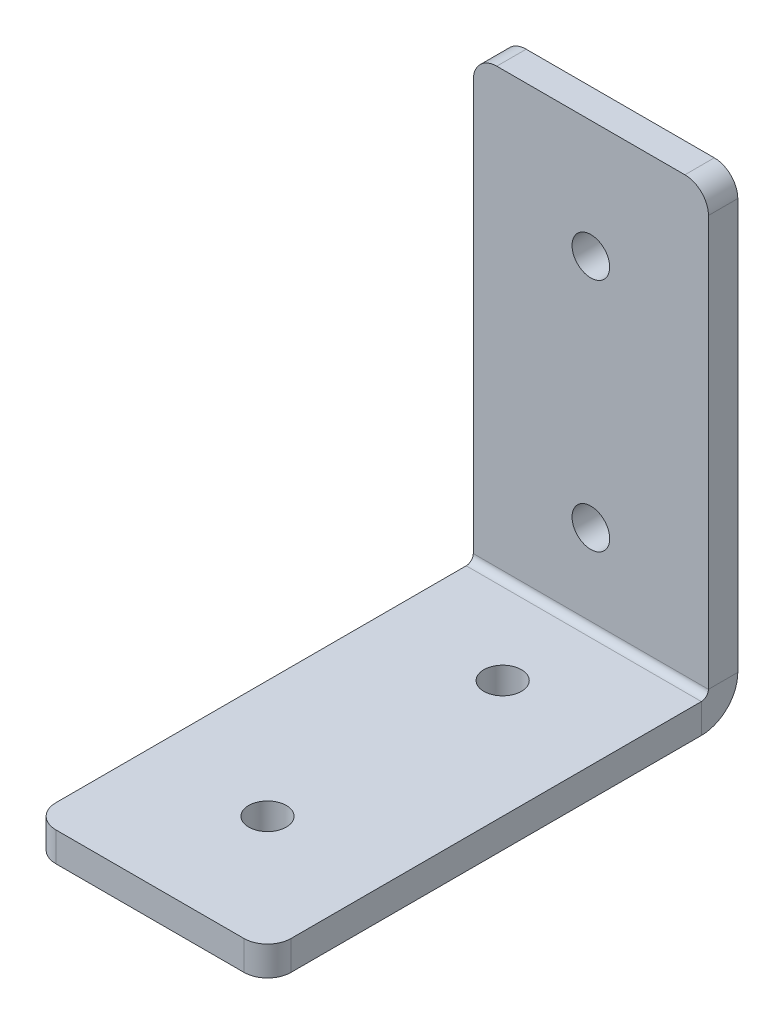
ISO-10303-21;
HEADER;
FILE_DESCRIPTION(('STEP AP214'),'2;1');
FILE_NAME('part.step','',(''),(''),'','','');
FILE_SCHEMA(('AUTOMOTIVE_DESIGN { 1 0 10303 214 1 1 1 1 }'));
ENDSEC;
DATA;
#1=APPLICATION_CONTEXT('core data for automotive mechanical design processes');
#2=APPLICATION_PROTOCOL_DEFINITION('international standard','automotive_design',2000,#1);
#3=PRODUCT_CONTEXT('',#1,'mechanical');
#4=PRODUCT('Part','Part','',(#3));
#5=PRODUCT_RELATED_PRODUCT_CATEGORY('part','',(#4));
#6=PRODUCT_DEFINITION_FORMATION('','',#4);
#7=PRODUCT_DEFINITION_CONTEXT('part definition',#1,'design');
#8=PRODUCT_DEFINITION('design','',#6,#7);
#9=PRODUCT_DEFINITION_SHAPE('','',#8);
#10=(LENGTH_UNIT() NAMED_UNIT(*) SI_UNIT(.MILLI.,.METRE.));
#11=(NAMED_UNIT(*) PLANE_ANGLE_UNIT() SI_UNIT($,.RADIAN.));
#12=(NAMED_UNIT(*) SI_UNIT($,.STERADIAN.) SOLID_ANGLE_UNIT());
#13=UNCERTAINTY_MEASURE_WITH_UNIT(LENGTH_MEASURE(1.E-05),#10,'distance_accuracy_value','');
#14=(GEOMETRIC_REPRESENTATION_CONTEXT(3) GLOBAL_UNCERTAINTY_ASSIGNED_CONTEXT((#13)) GLOBAL_UNIT_ASSIGNED_CONTEXT((#10,
#11,#12)) REPRESENTATION_CONTEXT('',''));
#15=CARTESIAN_POINT('',(0.,0.,0.));
#16=DIRECTION('',(0.,0.,1.));
#17=DIRECTION('',(1.,0.,0.));
#18=AXIS2_PLACEMENT_3D('',#15,#16,#17);
#19=CARTESIAN_POINT('',(-12.7,1.27,-25.4));
#20=DIRECTION('',(-1.,0.,0.));
#21=DIRECTION('',(0.,-1.,0.));
#22=AXIS2_PLACEMENT_3D('',#19,#20,#21);
#23=PLANE('',#22);
#24=DIRECTION('',(0.,1.,0.));
#25=VECTOR('',#24,1.);
#26=CARTESIAN_POINT('',(-12.7,1.27,-22.225));
#27=LINE('',#26,#25);
#28=CARTESIAN_POINT('',(-12.7,48.26,-22.225));
#29=VERTEX_POINT('',#28);
#30=CARTESIAN_POINT('',(-12.7,3.937,-22.225));
#31=VERTEX_POINT('',#30);
#32=EDGE_CURVE('E194',#29,#31,#27,.F.);
#33=ORIENTED_EDGE('',*,*,#32,.F.);
#34=DIRECTION('',(0.,0.,1.));
#35=VECTOR('',#34,1.);
#36=CARTESIAN_POINT('',(-12.7,48.26,-25.4));
#37=LINE('',#36,#35);
#38=CARTESIAN_POINT('',(-12.7,48.26,-25.4));
#39=VERTEX_POINT('',#38);
#40=EDGE_CURVE('E137',#29,#39,#37,.F.);
#41=ORIENTED_EDGE('',*,*,#40,.T.);
#42=DIRECTION('',(0.,-1.,0.));
#43=VECTOR('',#42,1.);
#44=CARTESIAN_POINT('',(-12.7,1.27,-25.4));
#45=LINE('',#44,#43);
#46=CARTESIAN_POINT('',(-12.7,3.937,-25.4));
#47=VERTEX_POINT('',#46);
#48=EDGE_CURVE('E131',#39,#47,#45,.T.);
#49=ORIENTED_EDGE('',*,*,#48,.T.);
#50=DIRECTION('',(0.,0.,-1.));
#51=VECTOR('',#50,1.);
#52=CARTESIAN_POINT('',(-12.7,3.937,-25.4));
#53=LINE('',#52,#51);
#54=EDGE_CURVE('E134',#31,#47,#53,.T.);
#55=ORIENTED_EDGE('',*,*,#54,.F.);
#56=EDGE_LOOP('',(#33,#41,#49,#55));
#57=FACE_BOUND('',#56,.T.);
#58=ADVANCED_FACE('F38',(#57),#23,.T.);
#59=CARTESIAN_POINT('',(12.7,50.8,-25.4));
#60=DIRECTION('',(0.,-1.,0.));
#61=DIRECTION('',(1.,0.,0.));
#62=AXIS2_PLACEMENT_3D('',#59,#60,#61);
#63=PLANE('',#62);
#64=DIRECTION('',(1.,0.,0.));
#65=VECTOR('',#64,1.);
#66=CARTESIAN_POINT('',(12.7,50.8,-25.4));
#67=LINE('',#66,#65);
#68=CARTESIAN_POINT('',(-10.16,50.8,-25.4));
#69=VERTEX_POINT('',#68);
#70=CARTESIAN_POINT('',(10.16,50.8,-25.4));
#71=VERTEX_POINT('',#70);
#72=EDGE_CURVE('E140',#69,#71,#67,.T.);
#73=ORIENTED_EDGE('',*,*,#72,.F.);
#74=DIRECTION('',(0.,0.,-1.));
#75=VECTOR('',#74,1.);
#76=CARTESIAN_POINT('',(-10.16,50.8,-25.4));
#77=LINE('',#76,#75);
#78=CARTESIAN_POINT('',(-10.16,50.8,-22.225));
#79=VERTEX_POINT('',#78);
#80=EDGE_CURVE('E224',#69,#79,#77,.F.);
#81=ORIENTED_EDGE('',*,*,#80,.T.);
#82=DIRECTION('',(1.,0.,0.));
#83=VECTOR('',#82,1.);
#84=CARTESIAN_POINT('',(-12.7,50.8,-22.225));
#85=LINE('',#84,#83);
#86=CARTESIAN_POINT('',(10.16,50.8,-22.225));
#87=VERTEX_POINT('',#86);
#88=EDGE_CURVE('E198',#79,#87,#85,.T.);
#89=ORIENTED_EDGE('',*,*,#88,.T.);
#90=DIRECTION('',(0.,0.,1.));
#91=VECTOR('',#90,1.);
#92=CARTESIAN_POINT('',(10.16,50.8,-25.4));
#93=LINE('',#92,#91);
#94=EDGE_CURVE('E221',#87,#71,#93,.F.);
#95=ORIENTED_EDGE('',*,*,#94,.T.);
#96=EDGE_LOOP('',(#73,#81,#89,#95));
#97=FACE_BOUND('',#96,.T.);
#98=ADVANCED_FACE('F294',(#97),#63,.F.);
#99=CARTESIAN_POINT('',(12.7,1.27,-25.4));
#100=DIRECTION('',(-1.,0.,0.));
#101=DIRECTION('',(0.,-1.,0.));
#102=AXIS2_PLACEMENT_3D('',#99,#100,#101);
#103=PLANE('',#102);
#104=DIRECTION('',(0.,-1.,0.));
#105=VECTOR('',#104,1.);
#106=CARTESIAN_POINT('',(12.7,1.27,-25.4));
#107=LINE('',#106,#105);
#108=CARTESIAN_POINT('',(12.7,48.26,-25.4));
#109=VERTEX_POINT('',#108);
#110=CARTESIAN_POINT('',(12.7,3.937,-25.4));
#111=VERTEX_POINT('',#110);
#112=EDGE_CURVE('E166',#109,#111,#107,.T.);
#113=ORIENTED_EDGE('',*,*,#112,.F.);
#114=DIRECTION('',(0.,0.,1.));
#115=VECTOR('',#114,1.);
#116=CARTESIAN_POINT('',(12.7,48.26,-25.4));
#117=LINE('',#116,#115);
#118=CARTESIAN_POINT('',(12.7,48.26,-22.225));
#119=VERTEX_POINT('',#118);
#120=EDGE_CURVE('E230',#109,#119,#117,.T.);
#121=ORIENTED_EDGE('',*,*,#120,.T.);
#122=DIRECTION('',(0.,1.,0.));
#123=VECTOR('',#122,1.);
#124=CARTESIAN_POINT('',(12.7,1.27,-22.225));
#125=LINE('',#124,#123);
#126=CARTESIAN_POINT('',(12.7,3.937,-22.225));
#127=VERTEX_POINT('',#126);
#128=EDGE_CURVE('E195',#119,#127,#125,.F.);
#129=ORIENTED_EDGE('',*,*,#128,.T.);
#130=DIRECTION('',(0.,0.,-1.));
#131=VECTOR('',#130,1.);
#132=CARTESIAN_POINT('',(12.7,3.937,-25.4));
#133=LINE('',#132,#131);
#134=EDGE_CURVE('E152',#127,#111,#133,.T.);
#135=ORIENTED_EDGE('',*,*,#134,.T.);
#136=EDGE_LOOP('',(#113,#121,#129,#135));
#137=FACE_BOUND('',#136,.T.);
#138=ADVANCED_FACE('F299',(#137),#103,.F.);
#139=CARTESIAN_POINT('',(12.7,3.937,-21.463));
#140=DIRECTION('',(1.,0.,0.));
#141=DIRECTION('',(0.,0.,-1.));
#142=AXIS2_PLACEMENT_3D('',#139,#140,#141);
#143=PLANE('',#142);
#144=ORIENTED_EDGE('',*,*,#134,.F.);
#145=CARTESIAN_POINT('',(12.7,3.937,-21.463));
#146=DIRECTION('',(1.,0.,0.));
#147=DIRECTION('',(0.,0.,-1.));
#148=AXIS2_PLACEMENT_3D('',#145,#146,#147);
#149=CIRCLE('',#148,0.762);
#150=CARTESIAN_POINT('',(12.7,3.175,-21.463));
#151=VERTEX_POINT('',#150);
#152=EDGE_CURVE('E191',#127,#151,#149,.F.);
#153=ORIENTED_EDGE('',*,*,#152,.T.);
#154=DIRECTION('',(0.,-1.,0.));
#155=VECTOR('',#154,1.);
#156=CARTESIAN_POINT('',(12.7,0.,-21.463));
#157=LINE('',#156,#155);
#158=CARTESIAN_POINT('',(12.7,0.,-21.463));
#159=VERTEX_POINT('',#158);
#160=EDGE_CURVE('E211',#151,#159,#157,.T.);
#161=ORIENTED_EDGE('',*,*,#160,.T.);
#162=CARTESIAN_POINT('',(12.7,3.937,-21.463));
#163=DIRECTION('',(-1.,0.,0.));
#164=DIRECTION('',(0.,0.,1.));
#165=AXIS2_PLACEMENT_3D('',#162,#163,#164);
#166=CIRCLE('',#165,3.937);
#167=EDGE_CURVE('E141',#111,#159,#166,.T.);
#168=ORIENTED_EDGE('',*,*,#167,.F.);
#169=EDGE_LOOP('',(#144,#153,#161,#168));
#170=FACE_BOUND('',#169,.T.);
#171=ADVANCED_FACE('F376',(#170),#143,.T.);
#172=CARTESIAN_POINT('',(12.7,0.,25.4));
#173=DIRECTION('',(-1.,0.,0.));
#174=DIRECTION('',(0.,0.,-1.));
#175=AXIS2_PLACEMENT_3D('',#172,#173,#174);
#176=PLANE('',#175);
#177=DIRECTION('',(0.,0.,-1.));
#178=VECTOR('',#177,1.);
#179=CARTESIAN_POINT('',(12.7,3.175,0.));
#180=LINE('',#179,#178);
#181=CARTESIAN_POINT('',(12.7,3.175,22.86));
#182=VERTEX_POINT('',#181);
#183=EDGE_CURVE('E185',#182,#151,#180,.T.);
#184=ORIENTED_EDGE('',*,*,#183,.F.);
#185=DIRECTION('',(0.,1.,0.));
#186=VECTOR('',#185,1.);
#187=CARTESIAN_POINT('',(12.7,0.,22.86));
#188=LINE('',#187,#186);
#189=CARTESIAN_POINT('',(12.7,0.,22.86));
#190=VERTEX_POINT('',#189);
#191=EDGE_CURVE('E11',#182,#190,#188,.F.);
#192=ORIENTED_EDGE('',*,*,#191,.T.);
#193=DIRECTION('',(0.,0.,-1.));
#194=VECTOR('',#193,1.);
#195=CARTESIAN_POINT('',(12.7,0.,25.4));
#196=LINE('',#195,#194);
#197=EDGE_CURVE('E262',#190,#159,#196,.T.);
#198=ORIENTED_EDGE('',*,*,#197,.T.);
#199=ORIENTED_EDGE('',*,*,#160,.F.);
#200=EDGE_LOOP('',(#184,#192,#198,#199));
#201=FACE_BOUND('',#200,.T.);
#202=ADVANCED_FACE('F337',(#201),#176,.F.);
#203=CARTESIAN_POINT('',(-12.7,0.,25.4));
#204=DIRECTION('',(0.,0.,-1.));
#205=DIRECTION('',(1.,0.,0.));
#206=AXIS2_PLACEMENT_3D('',#203,#204,#205);
#207=PLANE('',#206);
#208=DIRECTION('',(1.,0.,0.));
#209=VECTOR('',#208,1.);
#210=CARTESIAN_POINT('',(0.,3.175,25.4));
#211=LINE('',#210,#209);
#212=CARTESIAN_POINT('',(-10.16,3.175,25.4));
#213=VERTEX_POINT('',#212);
#214=CARTESIAN_POINT('',(10.16,3.175,25.4));
#215=VERTEX_POINT('',#214);
#216=EDGE_CURVE('E186',#213,#215,#211,.T.);
#217=ORIENTED_EDGE('',*,*,#216,.F.);
#218=DIRECTION('',(0.,1.,0.));
#219=VECTOR('',#218,1.);
#220=CARTESIAN_POINT('',(-10.16,0.,25.4));
#221=LINE('',#220,#219);
#222=CARTESIAN_POINT('',(-10.16,0.,25.4));
#223=VERTEX_POINT('',#222);
#224=EDGE_CURVE('E234',#213,#223,#221,.F.);
#225=ORIENTED_EDGE('',*,*,#224,.T.);
#226=DIRECTION('',(1.,0.,0.));
#227=VECTOR('',#226,1.);
#228=CARTESIAN_POINT('',(-12.7,0.,25.4));
#229=LINE('',#228,#227);
#230=CARTESIAN_POINT('',(10.16,0.,25.4));
#231=VERTEX_POINT('',#230);
#232=EDGE_CURVE('E260',#223,#231,#229,.T.);
#233=ORIENTED_EDGE('',*,*,#232,.T.);
#234=DIRECTION('',(0.,1.,0.));
#235=VECTOR('',#234,1.);
#236=CARTESIAN_POINT('',(10.16,0.,25.4));
#237=LINE('',#236,#235);
#238=EDGE_CURVE('E232',#231,#215,#237,.T.);
#239=ORIENTED_EDGE('',*,*,#238,.T.);
#240=EDGE_LOOP('',(#217,#225,#233,#239));
#241=FACE_BOUND('',#240,.T.);
#242=ADVANCED_FACE('F250',(#241),#207,.F.);
#243=CARTESIAN_POINT('',(-12.7,0.,25.4));
#244=DIRECTION('',(1.,0.,0.));
#245=DIRECTION('',(0.,0.,1.));
#246=AXIS2_PLACEMENT_3D('',#243,#244,#245);
#247=PLANE('',#246);
#248=DIRECTION('',(0.,0.,1.));
#249=VECTOR('',#248,1.);
#250=CARTESIAN_POINT('',(-12.7,0.,25.4));
#251=LINE('',#250,#249);
#252=CARTESIAN_POINT('',(-12.7,0.,-21.463));
#253=VERTEX_POINT('',#252);
#254=CARTESIAN_POINT('',(-12.7,0.,22.86));
#255=VERTEX_POINT('',#254);
#256=EDGE_CURVE('E259',#253,#255,#251,.T.);
#257=ORIENTED_EDGE('',*,*,#256,.T.);
#258=DIRECTION('',(0.,1.,0.));
#259=VECTOR('',#258,1.);
#260=CARTESIAN_POINT('',(-12.7,0.,22.86));
#261=LINE('',#260,#259);
#262=CARTESIAN_POINT('',(-12.7,3.175,22.86));
#263=VERTEX_POINT('',#262);
#264=EDGE_CURVE('E61',#255,#263,#261,.T.);
#265=ORIENTED_EDGE('',*,*,#264,.T.);
#266=DIRECTION('',(0.,0.,-1.));
#267=VECTOR('',#266,1.);
#268=CARTESIAN_POINT('',(-12.7,3.175,0.));
#269=LINE('',#268,#267);
#270=CARTESIAN_POINT('',(-12.7,3.175,-21.463));
#271=VERTEX_POINT('',#270);
#272=EDGE_CURVE('E183',#271,#263,#269,.F.);
#273=ORIENTED_EDGE('',*,*,#272,.F.);
#274=DIRECTION('',(0.,-1.,0.));
#275=VECTOR('',#274,1.);
#276=CARTESIAN_POINT('',(-12.7,0.,-21.463));
#277=LINE('',#276,#275);
#278=EDGE_CURVE('E170',#271,#253,#277,.T.);
#279=ORIENTED_EDGE('',*,*,#278,.T.);
#280=EDGE_LOOP('',(#257,#265,#273,#279));
#281=FACE_BOUND('',#280,.T.);
#282=ADVANCED_FACE('F261',(#281),#247,.F.);
#283=CARTESIAN_POINT('',(0.,38.1,-25.4));
#284=DIRECTION('',(0.,0.,-1.));
#285=DIRECTION('',(-1.,0.,0.));
#286=AXIS2_PLACEMENT_3D('',#283,#284,#285);
#287=CYLINDRICAL_SURFACE('',#286,2.032);
#288=CARTESIAN_POINT('',(0.,38.1,-25.4));
#289=DIRECTION('',(0.,0.,-1.));
#290=DIRECTION('',(1.,0.,0.));
#291=AXIS2_PLACEMENT_3D('',#288,#289,#290);
#292=CIRCLE('',#291,2.032);
#293=CARTESIAN_POINT('',(2.032,38.1,-25.4));
#294=VERTEX_POINT('',#293);
#295=EDGE_CURVE('E353',#294,#294,#292,.T.);
#296=ORIENTED_EDGE('',*,*,#295,.T.);
#297=EDGE_LOOP('',(#296));
#298=FACE_BOUND('',#297,.T.);
#299=CARTESIAN_POINT('',(0.,38.1,-22.225));
#300=DIRECTION('',(0.,0.,-1.));
#301=DIRECTION('',(-1.,0.,0.));
#302=AXIS2_PLACEMENT_3D('',#299,#300,#301);
#303=CIRCLE('',#302,2.032);
#304=CARTESIAN_POINT('',(-2.032,38.1,-22.225));
#305=VERTEX_POINT('',#304);
#306=EDGE_CURVE('E197',#305,#305,#303,.T.);
#307=ORIENTED_EDGE('',*,*,#306,.F.);
#308=EDGE_LOOP('',(#307));
#309=FACE_BOUND('',#308,.T.);
#310=ADVANCED_FACE('F309',(#298,#309),#287,.F.);
#311=CARTESIAN_POINT('',(0.,12.7,-25.4));
#312=DIRECTION('',(0.,0.,-1.));
#313=DIRECTION('',(-1.,0.,0.));
#314=AXIS2_PLACEMENT_3D('',#311,#312,#313);
#315=CYLINDRICAL_SURFACE('',#314,2.032);
#316=CARTESIAN_POINT('',(0.,12.7,-25.4));
#317=DIRECTION('',(0.,0.,-1.));
#318=DIRECTION('',(-1.,0.,0.));
#319=AXIS2_PLACEMENT_3D('',#316,#317,#318);
#320=CIRCLE('',#319,2.032);
#321=CARTESIAN_POINT('',(-2.032,12.7,-25.4));
#322=VERTEX_POINT('',#321);
#323=EDGE_CURVE('E265',#322,#322,#320,.T.);
#324=ORIENTED_EDGE('',*,*,#323,.T.);
#325=EDGE_LOOP('',(#324));
#326=FACE_BOUND('',#325,.T.);
#327=CARTESIAN_POINT('',(0.,12.7,-22.225));
#328=DIRECTION('',(0.,0.,-1.));
#329=DIRECTION('',(-1.,0.,0.));
#330=AXIS2_PLACEMENT_3D('',#327,#328,#329);
#331=CIRCLE('',#330,2.032);
#332=CARTESIAN_POINT('',(-2.032,12.7,-22.225));
#333=VERTEX_POINT('',#332);
#334=EDGE_CURVE('E188',#333,#333,#331,.T.);
#335=ORIENTED_EDGE('',*,*,#334,.F.);
#336=EDGE_LOOP('',(#335));
#337=FACE_BOUND('',#336,.T.);
#338=ADVANCED_FACE('F305',(#326,#337),#315,.F.);
#339=CARTESIAN_POINT('',(-12.7,3.937,-21.463));
#340=DIRECTION('',(1.,0.,0.));
#341=DIRECTION('',(0.,0.,-1.));
#342=AXIS2_PLACEMENT_3D('',#339,#340,#341);
#343=PLANE('',#342);
#344=CARTESIAN_POINT('',(-12.7,3.937,-21.463));
#345=DIRECTION('',(1.,0.,0.));
#346=DIRECTION('',(0.,0.,-1.));
#347=AXIS2_PLACEMENT_3D('',#344,#345,#346);
#348=CIRCLE('',#347,0.762);
#349=EDGE_CURVE('E151',#271,#31,#348,.T.);
#350=ORIENTED_EDGE('',*,*,#349,.T.);
#351=ORIENTED_EDGE('',*,*,#54,.T.);
#352=CARTESIAN_POINT('',(-12.7,3.937,-21.463));
#353=DIRECTION('',(-1.,0.,0.));
#354=DIRECTION('',(0.,0.,1.));
#355=AXIS2_PLACEMENT_3D('',#352,#353,#354);
#356=CIRCLE('',#355,3.937);
#357=EDGE_CURVE('E148',#253,#47,#356,.F.);
#358=ORIENTED_EDGE('',*,*,#357,.F.);
#359=ORIENTED_EDGE('',*,*,#278,.F.);
#360=EDGE_LOOP('',(#350,#351,#358,#359));
#361=FACE_BOUND('',#360,.T.);
#362=ADVANCED_FACE('F147',(#361),#343,.F.);
#363=CARTESIAN_POINT('',(0.,0.,-12.7));
#364=DIRECTION('',(0.,1.,0.));
#365=DIRECTION('',(0.,0.,1.));
#366=AXIS2_PLACEMENT_3D('',#363,#364,#365);
#367=CYLINDRICAL_SURFACE('',#366,2.032);
#368=CARTESIAN_POINT('',(0.,0.,-12.7));
#369=DIRECTION('',(0.,1.,0.));
#370=DIRECTION('',(0.,0.,1.));
#371=AXIS2_PLACEMENT_3D('',#368,#369,#370);
#372=CIRCLE('',#371,2.032);
#373=CARTESIAN_POINT('',(0.,0.,-10.668));
#374=VERTEX_POINT('',#373);
#375=EDGE_CURVE('E173',#374,#374,#372,.T.);
#376=ORIENTED_EDGE('',*,*,#375,.F.);
#377=EDGE_LOOP('',(#376));
#378=FACE_BOUND('',#377,.T.);
#379=CARTESIAN_POINT('',(0.,3.175,-12.7));
#380=DIRECTION('',(0.,1.,0.));
#381=DIRECTION('',(0.,0.,1.));
#382=AXIS2_PLACEMENT_3D('',#379,#380,#381);
#383=CIRCLE('',#382,2.032);
#384=CARTESIAN_POINT('',(0.,3.175,-10.668));
#385=VERTEX_POINT('',#384);
#386=EDGE_CURVE('E190',#385,#385,#383,.T.);
#387=ORIENTED_EDGE('',*,*,#386,.T.);
#388=EDGE_LOOP('',(#387));
#389=FACE_BOUND('',#388,.T.);
#390=ADVANCED_FACE('F272',(#378,#389),#367,.F.);
#391=CARTESIAN_POINT('',(0.,0.,12.7));
#392=DIRECTION('',(0.,1.,0.));
#393=DIRECTION('',(0.,0.,1.));
#394=AXIS2_PLACEMENT_3D('',#391,#392,#393);
#395=CYLINDRICAL_SURFACE('',#394,2.032);
#396=CARTESIAN_POINT('',(0.,0.,12.7));
#397=DIRECTION('',(0.,1.,0.));
#398=DIRECTION('',(0.,0.,-1.));
#399=AXIS2_PLACEMENT_3D('',#396,#397,#398);
#400=CIRCLE('',#399,2.032);
#401=CARTESIAN_POINT('',(0.,0.,10.668));
#402=VERTEX_POINT('',#401);
#403=EDGE_CURVE('E168',#402,#402,#400,.T.);
#404=ORIENTED_EDGE('',*,*,#403,.F.);
#405=EDGE_LOOP('',(#404));
#406=FACE_BOUND('',#405,.T.);
#407=CARTESIAN_POINT('',(0.,3.175,12.7));
#408=DIRECTION('',(0.,1.,0.));
#409=DIRECTION('',(0.,0.,1.));
#410=AXIS2_PLACEMENT_3D('',#407,#408,#409);
#411=CIRCLE('',#410,2.032);
#412=CARTESIAN_POINT('',(0.,3.175,14.732));
#413=VERTEX_POINT('',#412);
#414=EDGE_CURVE('E182',#413,#413,#411,.T.);
#415=ORIENTED_EDGE('',*,*,#414,.T.);
#416=EDGE_LOOP('',(#415));
#417=FACE_BOUND('',#416,.T.);
#418=ADVANCED_FACE('F275',(#406,#417),#395,.F.);
#419=CARTESIAN_POINT('',(0.,0.,0.));
#420=DIRECTION('',(0.,-1.,0.));
#421=DIRECTION('',(0.,0.,-1.));
#422=AXIS2_PLACEMENT_3D('',#419,#420,#421);
#423=PLANE('',#422);
#424=ORIENTED_EDGE('',*,*,#232,.F.);
#425=CARTESIAN_POINT('',(-10.16,0.,22.86));
#426=DIRECTION('',(0.,-1.,0.));
#427=DIRECTION('',(0.,0.,-1.));
#428=AXIS2_PLACEMENT_3D('',#425,#426,#427);
#429=CIRCLE('',#428,2.54);
#430=EDGE_CURVE('E239',#223,#255,#429,.T.);
#431=ORIENTED_EDGE('',*,*,#430,.T.);
#432=ORIENTED_EDGE('',*,*,#256,.F.);
#433=DIRECTION('',(-1.,0.,0.));
#434=VECTOR('',#433,1.);
#435=CARTESIAN_POINT('',(12.7,0.,-21.463));
#436=LINE('',#435,#434);
#437=EDGE_CURVE('E160',#253,#159,#436,.F.);
#438=ORIENTED_EDGE('',*,*,#437,.T.);
#439=ORIENTED_EDGE('',*,*,#197,.F.);
#440=CARTESIAN_POINT('',(10.16,0.,22.86));
#441=DIRECTION('',(0.,-1.,0.));
#442=DIRECTION('',(0.,0.,-1.));
#443=AXIS2_PLACEMENT_3D('',#440,#441,#442);
#444=CIRCLE('',#443,2.54);
#445=EDGE_CURVE('E237',#190,#231,#444,.T.);
#446=ORIENTED_EDGE('',*,*,#445,.T.);
#447=EDGE_LOOP('',(#424,#431,#432,#438,#439,#446));
#448=FACE_BOUND('',#447,.T.);
#449=ORIENTED_EDGE('',*,*,#375,.T.);
#450=EDGE_LOOP('',(#449));
#451=FACE_BOUND('',#450,.T.);
#452=ORIENTED_EDGE('',*,*,#403,.T.);
#453=EDGE_LOOP('',(#452));
#454=FACE_BOUND('',#453,.T.);
#455=ADVANCED_FACE('F257',(#448,#451,#454),#423,.T.);
#456=CARTESIAN_POINT('',(-12.7,1.27,-25.4));
#457=DIRECTION('',(0.,0.,1.));
#458=DIRECTION('',(1.,0.,0.));
#459=AXIS2_PLACEMENT_3D('',#456,#457,#458);
#460=PLANE('',#459);
#461=ORIENTED_EDGE('',*,*,#48,.F.);
#462=CARTESIAN_POINT('',(-10.16,48.26,-25.4));
#463=DIRECTION('',(0.,0.,1.));
#464=DIRECTION('',(1.,0.,0.));
#465=AXIS2_PLACEMENT_3D('',#462,#463,#464);
#466=CIRCLE('',#465,2.54);
#467=EDGE_CURVE('E219',#39,#69,#466,.F.);
#468=ORIENTED_EDGE('',*,*,#467,.T.);
#469=ORIENTED_EDGE('',*,*,#72,.T.);
#470=CARTESIAN_POINT('',(10.16,48.26,-25.4));
#471=DIRECTION('',(0.,0.,1.));
#472=DIRECTION('',(1.,0.,0.));
#473=AXIS2_PLACEMENT_3D('',#470,#471,#472);
#474=CIRCLE('',#473,2.54);
#475=EDGE_CURVE('E217',#71,#109,#474,.F.);
#476=ORIENTED_EDGE('',*,*,#475,.T.);
#477=ORIENTED_EDGE('',*,*,#112,.T.);
#478=DIRECTION('',(-1.,0.,0.));
#479=VECTOR('',#478,1.);
#480=CARTESIAN_POINT('',(-12.7,3.937,-25.4));
#481=LINE('',#480,#479);
#482=EDGE_CURVE('E158',#111,#47,#481,.T.);
#483=ORIENTED_EDGE('',*,*,#482,.T.);
#484=EDGE_LOOP('',(#461,#468,#469,#476,#477,#483));
#485=FACE_BOUND('',#484,.T.);
#486=ORIENTED_EDGE('',*,*,#295,.F.);
#487=EDGE_LOOP('',(#486));
#488=FACE_BOUND('',#487,.T.);
#489=ORIENTED_EDGE('',*,*,#323,.F.);
#490=EDGE_LOOP('',(#489));
#491=FACE_BOUND('',#490,.T.);
#492=ADVANCED_FACE('F163',(#485,#488,#491),#460,.F.);
#493=CARTESIAN_POINT('',(-12.7,3.937,-21.463));
#494=DIRECTION('',(1.,0.,0.));
#495=DIRECTION('',(0.,0.,-1.));
#496=AXIS2_PLACEMENT_3D('',#493,#494,#495);
#497=CYLINDRICAL_SURFACE('',#496,3.937);
#498=ORIENTED_EDGE('',*,*,#167,.T.);
#499=ORIENTED_EDGE('',*,*,#437,.F.);
#500=ORIENTED_EDGE('',*,*,#357,.T.);
#501=ORIENTED_EDGE('',*,*,#482,.F.);
#502=EDGE_LOOP('',(#498,#499,#500,#501));
#503=FACE_BOUND('',#502,.T.);
#504=ADVANCED_FACE('F157',(#503),#497,.T.);
#505=CARTESIAN_POINT('',(0.,3.175,0.));
#506=DIRECTION('',(0.,-1.,0.));
#507=DIRECTION('',(0.,0.,-1.));
#508=AXIS2_PLACEMENT_3D('',#505,#506,#507);
#509=PLANE('',#508);
#510=ORIENTED_EDGE('',*,*,#272,.T.);
#511=CARTESIAN_POINT('',(-10.16,3.175,22.86));
#512=DIRECTION('',(0.,-1.,0.));
#513=DIRECTION('',(0.,0.,-1.));
#514=AXIS2_PLACEMENT_3D('',#511,#512,#513);
#515=CIRCLE('',#514,2.54);
#516=EDGE_CURVE('E46',#263,#213,#515,.F.);
#517=ORIENTED_EDGE('',*,*,#516,.T.);
#518=ORIENTED_EDGE('',*,*,#216,.T.);
#519=CARTESIAN_POINT('',(10.16,3.175,22.86));
#520=DIRECTION('',(0.,-1.,0.));
#521=DIRECTION('',(0.,0.,-1.));
#522=AXIS2_PLACEMENT_3D('',#519,#520,#521);
#523=CIRCLE('',#522,2.54);
#524=EDGE_CURVE('E53',#215,#182,#523,.F.);
#525=ORIENTED_EDGE('',*,*,#524,.T.);
#526=ORIENTED_EDGE('',*,*,#183,.T.);
#527=DIRECTION('',(1.,0.,0.));
#528=VECTOR('',#527,1.);
#529=CARTESIAN_POINT('',(0.,3.175,-21.463));
#530=LINE('',#529,#528);
#531=EDGE_CURVE('E161',#271,#151,#530,.T.);
#532=ORIENTED_EDGE('',*,*,#531,.F.);
#533=EDGE_LOOP('',(#510,#517,#518,#525,#526,#532));
#534=FACE_BOUND('',#533,.T.);
#535=ORIENTED_EDGE('',*,*,#386,.F.);
#536=EDGE_LOOP('',(#535));
#537=FACE_BOUND('',#536,.T.);
#538=ORIENTED_EDGE('',*,*,#414,.F.);
#539=EDGE_LOOP('',(#538));
#540=FACE_BOUND('',#539,.T.);
#541=ADVANCED_FACE('F244',(#534,#537,#540),#509,.F.);
#542=CARTESIAN_POINT('',(-12.7,1.27,-22.225));
#543=DIRECTION('',(0.,0.,1.));
#544=DIRECTION('',(1.,0.,0.));
#545=AXIS2_PLACEMENT_3D('',#542,#543,#544);
#546=PLANE('',#545);
#547=ORIENTED_EDGE('',*,*,#88,.F.);
#548=CARTESIAN_POINT('',(-10.16,48.26,-22.225));
#549=DIRECTION('',(0.,0.,1.));
#550=DIRECTION('',(1.,0.,0.));
#551=AXIS2_PLACEMENT_3D('',#548,#549,#550);
#552=CIRCLE('',#551,2.54);
#553=EDGE_CURVE('E228',#79,#29,#552,.T.);
#554=ORIENTED_EDGE('',*,*,#553,.T.);
#555=ORIENTED_EDGE('',*,*,#32,.T.);
#556=DIRECTION('',(1.,0.,0.));
#557=VECTOR('',#556,1.);
#558=CARTESIAN_POINT('',(-12.7,3.937,-22.225));
#559=LINE('',#558,#557);
#560=EDGE_CURVE('E180',#127,#31,#559,.F.);
#561=ORIENTED_EDGE('',*,*,#560,.F.);
#562=ORIENTED_EDGE('',*,*,#128,.F.);
#563=CARTESIAN_POINT('',(10.16,48.26,-22.225));
#564=DIRECTION('',(0.,0.,1.));
#565=DIRECTION('',(1.,0.,0.));
#566=AXIS2_PLACEMENT_3D('',#563,#564,#565);
#567=CIRCLE('',#566,2.54);
#568=EDGE_CURVE('E226',#119,#87,#567,.T.);
#569=ORIENTED_EDGE('',*,*,#568,.T.);
#570=EDGE_LOOP('',(#547,#554,#555,#561,#562,#569));
#571=FACE_BOUND('',#570,.T.);
#572=ORIENTED_EDGE('',*,*,#306,.T.);
#573=EDGE_LOOP('',(#572));
#574=FACE_BOUND('',#573,.T.);
#575=ORIENTED_EDGE('',*,*,#334,.T.);
#576=EDGE_LOOP('',(#575));
#577=FACE_BOUND('',#576,.T.);
#578=ADVANCED_FACE('F280',(#571,#574,#577),#546,.T.);
#579=CARTESIAN_POINT('',(-12.7,3.937,-21.463));
#580=DIRECTION('',(1.,0.,0.));
#581=DIRECTION('',(0.,0.,-1.));
#582=AXIS2_PLACEMENT_3D('',#579,#580,#581);
#583=CYLINDRICAL_SURFACE('',#582,0.762);
#584=ORIENTED_EDGE('',*,*,#152,.F.);
#585=ORIENTED_EDGE('',*,*,#560,.T.);
#586=ORIENTED_EDGE('',*,*,#349,.F.);
#587=ORIENTED_EDGE('',*,*,#531,.T.);
#588=EDGE_LOOP('',(#584,#585,#586,#587));
#589=FACE_BOUND('',#588,.T.);
#590=ADVANCED_FACE('F323',(#589),#583,.F.);
#591=CARTESIAN_POINT('',(-10.16,48.26,-25.4));
#592=DIRECTION('',(0.,0.,1.));
#593=DIRECTION('',(1.,0.,0.));
#594=AXIS2_PLACEMENT_3D('',#591,#592,#593);
#595=CYLINDRICAL_SURFACE('',#594,2.54);
#596=ORIENTED_EDGE('',*,*,#553,.F.);
#597=ORIENTED_EDGE('',*,*,#80,.F.);
#598=ORIENTED_EDGE('',*,*,#467,.F.);
#599=ORIENTED_EDGE('',*,*,#40,.F.);
#600=EDGE_LOOP('',(#596,#597,#598,#599));
#601=FACE_BOUND('',#600,.T.);
#602=ADVANCED_FACE('F319',(#601),#595,.T.);
#603=CARTESIAN_POINT('',(10.16,48.26,-25.4));
#604=DIRECTION('',(0.,0.,-1.));
#605=DIRECTION('',(-1.,0.,0.));
#606=AXIS2_PLACEMENT_3D('',#603,#604,#605);
#607=CYLINDRICAL_SURFACE('',#606,2.54);
#608=ORIENTED_EDGE('',*,*,#568,.F.);
#609=ORIENTED_EDGE('',*,*,#120,.F.);
#610=ORIENTED_EDGE('',*,*,#475,.F.);
#611=ORIENTED_EDGE('',*,*,#94,.F.);
#612=EDGE_LOOP('',(#608,#609,#610,#611));
#613=FACE_BOUND('',#612,.T.);
#614=ADVANCED_FACE('F322',(#613),#607,.T.);
#615=CARTESIAN_POINT('',(-10.16,0.,22.86));
#616=DIRECTION('',(0.,-1.,0.));
#617=DIRECTION('',(0.,0.,-1.));
#618=AXIS2_PLACEMENT_3D('',#615,#616,#617);
#619=CYLINDRICAL_SURFACE('',#618,2.54);
#620=ORIENTED_EDGE('',*,*,#516,.F.);
#621=ORIENTED_EDGE('',*,*,#264,.F.);
#622=ORIENTED_EDGE('',*,*,#430,.F.);
#623=ORIENTED_EDGE('',*,*,#224,.F.);
#624=EDGE_LOOP('',(#620,#621,#622,#623));
#625=FACE_BOUND('',#624,.T.);
#626=ADVANCED_FACE('F254',(#625),#619,.T.);
#627=CARTESIAN_POINT('',(10.16,0.,22.86));
#628=DIRECTION('',(0.,-1.,0.));
#629=DIRECTION('',(0.,0.,-1.));
#630=AXIS2_PLACEMENT_3D('',#627,#628,#629);
#631=CYLINDRICAL_SURFACE('',#630,2.54);
#632=ORIENTED_EDGE('',*,*,#524,.F.);
#633=ORIENTED_EDGE('',*,*,#238,.F.);
#634=ORIENTED_EDGE('',*,*,#445,.F.);
#635=ORIENTED_EDGE('',*,*,#191,.F.);
#636=EDGE_LOOP('',(#632,#633,#634,#635));
#637=FACE_BOUND('',#636,.T.);
#638=ADVANCED_FACE('F40',(#637),#631,.T.);
#639=CLOSED_SHELL('',(#58,#98,#138,#171,#202,#242,#282,#310,#338,#362,#390,#418,#455,#492,#504,
#541,#578,#590,#602,#614,#626,#638));
#640=MANIFOLD_SOLID_BREP('B2',#639);
#641=ADVANCED_BREP_SHAPE_REPRESENTATION('',(#18,#640),#14);
#642=SHAPE_DEFINITION_REPRESENTATION(#9,#641);
ENDSEC;
END-ISO-10303-21;
